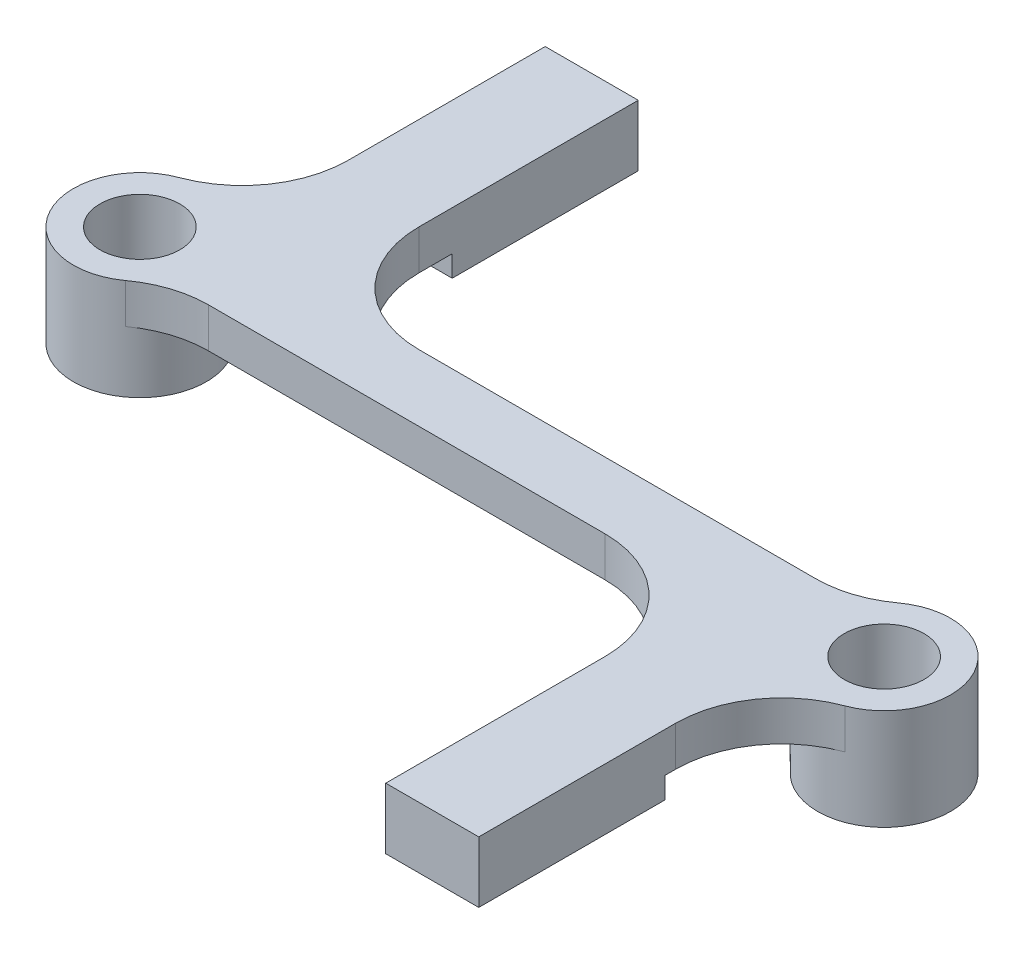
ISO-10303-21;
HEADER;
FILE_DESCRIPTION(('STEP AP214'),'2;1');
FILE_NAME('part.step','',(''),(''),'','','');
FILE_SCHEMA(('AUTOMOTIVE_DESIGN { 1 0 10303 214 1 1 1 1 }'));
ENDSEC;
DATA;
#1=APPLICATION_CONTEXT('core data for automotive mechanical design processes');
#2=APPLICATION_PROTOCOL_DEFINITION('international standard','automotive_design',2000,#1);
#3=PRODUCT_CONTEXT('',#1,'mechanical');
#4=PRODUCT('Part','Part','',(#3));
#5=PRODUCT_RELATED_PRODUCT_CATEGORY('part','',(#4));
#6=PRODUCT_DEFINITION_FORMATION('','',#4);
#7=PRODUCT_DEFINITION_CONTEXT('part definition',#1,'design');
#8=PRODUCT_DEFINITION('design','',#6,#7);
#9=PRODUCT_DEFINITION_SHAPE('','',#8);
#10=(LENGTH_UNIT() NAMED_UNIT(*) SI_UNIT(.MILLI.,.METRE.));
#11=(NAMED_UNIT(*) PLANE_ANGLE_UNIT() SI_UNIT($,.RADIAN.));
#12=(NAMED_UNIT(*) SI_UNIT($,.STERADIAN.) SOLID_ANGLE_UNIT());
#13=UNCERTAINTY_MEASURE_WITH_UNIT(LENGTH_MEASURE(1.E-05),#10,'distance_accuracy_value','');
#14=(GEOMETRIC_REPRESENTATION_CONTEXT(3) GLOBAL_UNCERTAINTY_ASSIGNED_CONTEXT((#13)) GLOBAL_UNIT_ASSIGNED_CONTEXT((#10,
#11,#12)) REPRESENTATION_CONTEXT('',''));
#15=CARTESIAN_POINT('',(0.,0.,0.));
#16=DIRECTION('',(0.,0.,1.));
#17=DIRECTION('',(1.,0.,0.));
#18=AXIS2_PLACEMENT_3D('',#15,#16,#17);
#19=CARTESIAN_POINT('',(-8.75,-12.7401923062409,0.));
#20=DIRECTION('',(1.,0.,0.));
#21=DIRECTION('',(0.,0.,-1.));
#22=AXIS2_PLACEMENT_3D('',#19,#20,#21);
#23=PLANE('',#22);
#24=DIRECTION('',(0.,0.,-1.));
#25=VECTOR('',#24,1.);
#26=CARTESIAN_POINT('',(-8.75,3.8,0.));
#27=LINE('',#26,#25);
#28=CARTESIAN_POINT('',(-8.75,3.8,-5.25));
#29=VERTEX_POINT('',#28);
#30=CARTESIAN_POINT('',(-8.75,3.8,-13.5));
#31=VERTEX_POINT('',#30);
#32=EDGE_CURVE('E202',#29,#31,#27,.T.);
#33=ORIENTED_EDGE('',*,*,#32,.F.);
#34=DIRECTION('',(0.,1.,0.));
#35=VECTOR('',#34,1.);
#36=CARTESIAN_POINT('',(-8.75,2.3,-5.25));
#37=LINE('',#36,#35);
#38=CARTESIAN_POINT('',(-8.75,2.3,-5.25));
#39=VERTEX_POINT('',#38);
#40=EDGE_CURVE('E245',#29,#39,#37,.F.);
#41=ORIENTED_EDGE('',*,*,#40,.T.);
#42=DIRECTION('',(0.,0.,1.));
#43=VECTOR('',#42,1.);
#44=CARTESIAN_POINT('',(-8.75,2.3,0.));
#45=LINE('',#44,#43);
#46=CARTESIAN_POINT('',(-8.75,2.3,-6.5));
#47=VERTEX_POINT('',#46);
#48=EDGE_CURVE('E313',#47,#39,#45,.T.);
#49=ORIENTED_EDGE('',*,*,#48,.F.);
#50=DIRECTION('',(0.,-1.,0.));
#51=VECTOR('',#50,1.);
#52=CARTESIAN_POINT('',(-8.75,31.5353564967173,-6.5));
#53=LINE('',#52,#51);
#54=CARTESIAN_POINT('',(-8.75,1.5,-6.5));
#55=VERTEX_POINT('',#54);
#56=EDGE_CURVE('E192',#47,#55,#53,.T.);
#57=ORIENTED_EDGE('',*,*,#56,.T.);
#58=DIRECTION('',(0.,0.,1.));
#59=VECTOR('',#58,1.);
#60=CARTESIAN_POINT('',(-8.75,1.5,-13.5));
#61=LINE('',#60,#59);
#62=CARTESIAN_POINT('',(-8.75,1.5,-13.5));
#63=VERTEX_POINT('',#62);
#64=EDGE_CURVE('E175',#63,#55,#61,.T.);
#65=ORIENTED_EDGE('',*,*,#64,.F.);
#66=DIRECTION('',(0.,1.,0.));
#67=VECTOR('',#66,1.);
#68=CARTESIAN_POINT('',(-8.75,-12.7401923062409,-13.5));
#69=LINE('',#68,#67);
#70=EDGE_CURVE('E189',#63,#31,#69,.T.);
#71=ORIENTED_EDGE('',*,*,#70,.T.);
#72=EDGE_LOOP('',(#33,#41,#49,#57,#65,#71));
#73=FACE_BOUND('',#72,.T.);
#74=ADVANCED_FACE('F38',(#73),#23,.T.);
#75=CARTESIAN_POINT('',(0.,-12.7401923062409,-13.5));
#76=DIRECTION('',(0.,0.,1.));
#77=DIRECTION('',(1.,0.,0.));
#78=AXIS2_PLACEMENT_3D('',#75,#76,#77);
#79=PLANE('',#78);
#80=DIRECTION('',(1.,0.,0.));
#81=VECTOR('',#80,1.);
#82=CARTESIAN_POINT('',(-12.25,1.5,-13.5));
#83=LINE('',#82,#81);
#84=CARTESIAN_POINT('',(-12.25,1.5,-13.5));
#85=VERTEX_POINT('',#84);
#86=EDGE_CURVE('E172',#85,#63,#83,.T.);
#87=ORIENTED_EDGE('',*,*,#86,.F.);
#88=DIRECTION('',(0.,1.,0.));
#89=VECTOR('',#88,1.);
#90=CARTESIAN_POINT('',(-12.25,-12.7401923062409,-13.5));
#91=LINE('',#90,#89);
#92=CARTESIAN_POINT('',(-12.25,3.8,-13.5));
#93=VERTEX_POINT('',#92);
#94=EDGE_CURVE('E198',#85,#93,#91,.T.);
#95=ORIENTED_EDGE('',*,*,#94,.T.);
#96=DIRECTION('',(1.,0.,0.));
#97=VECTOR('',#96,1.);
#98=CARTESIAN_POINT('',(0.,3.8,-13.5));
#99=LINE('',#98,#97);
#100=EDGE_CURVE('E197',#93,#31,#99,.T.);
#101=ORIENTED_EDGE('',*,*,#100,.T.);
#102=ORIENTED_EDGE('',*,*,#70,.F.);
#103=EDGE_LOOP('',(#87,#95,#101,#102));
#104=FACE_BOUND('',#103,.T.);
#105=ADVANCED_FACE('F195',(#104),#79,.F.);
#106=CARTESIAN_POINT('',(-12.25,-12.7401923062409,0.));
#107=DIRECTION('',(1.,0.,0.));
#108=DIRECTION('',(0.,0.,-1.));
#109=AXIS2_PLACEMENT_3D('',#106,#107,#108);
#110=PLANE('',#109);
#111=DIRECTION('',(0.,0.,-1.));
#112=VECTOR('',#111,1.);
#113=CARTESIAN_POINT('',(-12.25,2.3,0.));
#114=LINE('',#113,#112);
#115=CARTESIAN_POINT('',(-12.25,2.3,-6.09815545882523));
#116=VERTEX_POINT('',#115);
#117=CARTESIAN_POINT('',(-12.25,2.3,-6.5));
#118=VERTEX_POINT('',#117);
#119=EDGE_CURVE('E320',#116,#118,#114,.T.);
#120=ORIENTED_EDGE('',*,*,#119,.F.);
#121=DIRECTION('',(0.,1.,0.));
#122=VECTOR('',#121,1.);
#123=CARTESIAN_POINT('',(-12.25,3.8,-6.09815545882523));
#124=LINE('',#123,#122);
#125=CARTESIAN_POINT('',(-12.25,3.8,-6.09815545882523));
#126=VERTEX_POINT('',#125);
#127=EDGE_CURVE('E247',#116,#126,#124,.T.);
#128=ORIENTED_EDGE('',*,*,#127,.T.);
#129=DIRECTION('',(0.,0.,-1.));
#130=VECTOR('',#129,1.);
#131=CARTESIAN_POINT('',(-12.25,3.8,0.));
#132=LINE('',#131,#130);
#133=EDGE_CURVE('E344',#126,#93,#132,.T.);
#134=ORIENTED_EDGE('',*,*,#133,.T.);
#135=ORIENTED_EDGE('',*,*,#94,.F.);
#136=DIRECTION('',(0.,0.,-1.));
#137=VECTOR('',#136,1.);
#138=CARTESIAN_POINT('',(-12.25,1.5,-6.5));
#139=LINE('',#138,#137);
#140=CARTESIAN_POINT('',(-12.25,1.5,-6.5));
#141=VERTEX_POINT('',#140);
#142=EDGE_CURVE('E178',#141,#85,#139,.T.);
#143=ORIENTED_EDGE('',*,*,#142,.F.);
#144=DIRECTION('',(0.,-1.,0.));
#145=VECTOR('',#144,1.);
#146=CARTESIAN_POINT('',(-12.25,31.5353564967173,-6.5));
#147=LINE('',#146,#145);
#148=EDGE_CURVE('E327',#118,#141,#147,.T.);
#149=ORIENTED_EDGE('',*,*,#148,.F.);
#150=EDGE_LOOP('',(#120,#128,#134,#135,#143,#149));
#151=FACE_BOUND('',#150,.T.);
#152=ADVANCED_FACE('F378',(#151),#110,.F.);
#153=CARTESIAN_POINT('',(12.25,-12.7401923062409,1.25));
#154=DIRECTION('',(-1.,0.,0.));
#155=DIRECTION('',(0.,0.,1.));
#156=AXIS2_PLACEMENT_3D('',#153,#154,#155);
#157=PLANE('',#156);
#158=DIRECTION('',(0.,0.,1.));
#159=VECTOR('',#158,1.);
#160=CARTESIAN_POINT('',(12.25,2.3,0.));
#161=LINE('',#160,#159);
#162=CARTESIAN_POINT('',(12.25,2.3,6.09815545882523));
#163=VERTEX_POINT('',#162);
#164=CARTESIAN_POINT('',(12.25,2.3,6.5));
#165=VERTEX_POINT('',#164);
#166=EDGE_CURVE('E302',#163,#165,#161,.T.);
#167=ORIENTED_EDGE('',*,*,#166,.F.);
#168=DIRECTION('',(0.,1.,0.));
#169=VECTOR('',#168,1.);
#170=CARTESIAN_POINT('',(12.25,3.8,6.09815545882523));
#171=LINE('',#170,#169);
#172=CARTESIAN_POINT('',(12.25,3.8,6.09815545882523));
#173=VERTEX_POINT('',#172);
#174=EDGE_CURVE('E263',#163,#173,#171,.T.);
#175=ORIENTED_EDGE('',*,*,#174,.T.);
#176=DIRECTION('',(0.,0.,1.));
#177=VECTOR('',#176,1.);
#178=CARTESIAN_POINT('',(12.25,3.8,6.5));
#179=LINE('',#178,#177);
#180=CARTESIAN_POINT('',(12.25,3.8,13.5));
#181=VERTEX_POINT('',#180);
#182=EDGE_CURVE('E293',#173,#181,#179,.T.);
#183=ORIENTED_EDGE('',*,*,#182,.T.);
#184=DIRECTION('',(0.,1.,0.));
#185=VECTOR('',#184,1.);
#186=CARTESIAN_POINT('',(12.25,-12.7401923062409,13.5));
#187=LINE('',#186,#185);
#188=CARTESIAN_POINT('',(12.25,1.5,13.5));
#189=VERTEX_POINT('',#188);
#190=EDGE_CURVE('E334',#189,#181,#187,.T.);
#191=ORIENTED_EDGE('',*,*,#190,.F.);
#192=DIRECTION('',(0.,0.,1.));
#193=VECTOR('',#192,1.);
#194=CARTESIAN_POINT('',(12.25,1.5,6.5));
#195=LINE('',#194,#193);
#196=CARTESIAN_POINT('',(12.25,1.5,6.5));
#197=VERTEX_POINT('',#196);
#198=EDGE_CURVE('E673',#197,#189,#195,.T.);
#199=ORIENTED_EDGE('',*,*,#198,.F.);
#200=DIRECTION('',(0.,-1.,0.));
#201=VECTOR('',#200,1.);
#202=CARTESIAN_POINT('',(12.25,31.5353564967173,6.5));
#203=LINE('',#202,#201);
#204=EDGE_CURVE('E305',#165,#197,#203,.T.);
#205=ORIENTED_EDGE('',*,*,#204,.F.);
#206=EDGE_LOOP('',(#167,#175,#183,#191,#199,#205));
#207=FACE_BOUND('',#206,.T.);
#208=ADVANCED_FACE('F298',(#207),#157,.F.);
#209=CARTESIAN_POINT('',(8.75,-12.7401923062409,1.25));
#210=DIRECTION('',(-1.,0.,0.));
#211=DIRECTION('',(0.,0.,1.));
#212=AXIS2_PLACEMENT_3D('',#209,#210,#211);
#213=PLANE('',#212);
#214=DIRECTION('',(0.,0.,1.));
#215=VECTOR('',#214,1.);
#216=CARTESIAN_POINT('',(8.75,3.8,6.5));
#217=LINE('',#216,#215);
#218=CARTESIAN_POINT('',(8.75,3.8,5.25));
#219=VERTEX_POINT('',#218);
#220=CARTESIAN_POINT('',(8.75,3.8,13.5));
#221=VERTEX_POINT('',#220);
#222=EDGE_CURVE('E336',#219,#221,#217,.T.);
#223=ORIENTED_EDGE('',*,*,#222,.F.);
#224=DIRECTION('',(0.,1.,0.));
#225=VECTOR('',#224,1.);
#226=CARTESIAN_POINT('',(8.75,-12.7401923062409,5.25));
#227=LINE('',#226,#225);
#228=CARTESIAN_POINT('',(8.75,2.3,5.25));
#229=VERTEX_POINT('',#228);
#230=EDGE_CURVE('E261',#219,#229,#227,.F.);
#231=ORIENTED_EDGE('',*,*,#230,.T.);
#232=DIRECTION('',(0.,0.,-1.));
#233=VECTOR('',#232,1.);
#234=CARTESIAN_POINT('',(8.75,2.3,0.));
#235=LINE('',#234,#233);
#236=CARTESIAN_POINT('',(8.75,2.3,6.5));
#237=VERTEX_POINT('',#236);
#238=EDGE_CURVE('E329',#237,#229,#235,.T.);
#239=ORIENTED_EDGE('',*,*,#238,.F.);
#240=DIRECTION('',(0.,-1.,0.));
#241=VECTOR('',#240,1.);
#242=CARTESIAN_POINT('',(8.75,31.5353564967173,6.5));
#243=LINE('',#242,#241);
#244=CARTESIAN_POINT('',(8.75,1.5,6.5));
#245=VERTEX_POINT('',#244);
#246=EDGE_CURVE('E310',#237,#245,#243,.T.);
#247=ORIENTED_EDGE('',*,*,#246,.T.);
#248=DIRECTION('',(0.,0.,-1.));
#249=VECTOR('',#248,1.);
#250=CARTESIAN_POINT('',(8.75,1.5,13.5));
#251=LINE('',#250,#249);
#252=CARTESIAN_POINT('',(8.75,1.5,13.5));
#253=VERTEX_POINT('',#252);
#254=EDGE_CURVE('E668',#253,#245,#251,.T.);
#255=ORIENTED_EDGE('',*,*,#254,.F.);
#256=DIRECTION('',(0.,1.,0.));
#257=VECTOR('',#256,1.);
#258=CARTESIAN_POINT('',(8.75,-12.7401923062409,13.5));
#259=LINE('',#258,#257);
#260=EDGE_CURVE('E337',#253,#221,#259,.T.);
#261=ORIENTED_EDGE('',*,*,#260,.T.);
#262=EDGE_LOOP('',(#223,#231,#239,#247,#255,#261));
#263=FACE_BOUND('',#262,.T.);
#264=ADVANCED_FACE('F503',(#263),#213,.T.);
#265=CARTESIAN_POINT('',(8.75,-12.7401923062409,13.5));
#266=DIRECTION('',(0.,0.,1.));
#267=DIRECTION('',(1.,0.,0.));
#268=AXIS2_PLACEMENT_3D('',#265,#266,#267);
#269=PLANE('',#268);
#270=ORIENTED_EDGE('',*,*,#260,.F.);
#271=DIRECTION('',(-1.,0.,0.));
#272=VECTOR('',#271,1.);
#273=CARTESIAN_POINT('',(12.25,1.5,13.5));
#274=LINE('',#273,#272);
#275=EDGE_CURVE('E183',#189,#253,#274,.T.);
#276=ORIENTED_EDGE('',*,*,#275,.F.);
#277=ORIENTED_EDGE('',*,*,#190,.T.);
#278=DIRECTION('',(1.,0.,0.));
#279=VECTOR('',#278,1.);
#280=CARTESIAN_POINT('',(8.75,3.8,13.5));
#281=LINE('',#280,#279);
#282=EDGE_CURVE('E342',#221,#181,#281,.T.);
#283=ORIENTED_EDGE('',*,*,#282,.F.);
#284=EDGE_LOOP('',(#270,#276,#277,#283));
#285=FACE_BOUND('',#284,.T.);
#286=ADVANCED_FACE('F507',(#285),#269,.T.);
#287=CARTESIAN_POINT('',(0.,31.5353564967173,-6.5));
#288=DIRECTION('',(0.,0.,-1.));
#289=DIRECTION('',(-1.,0.,0.));
#290=AXIS2_PLACEMENT_3D('',#287,#288,#289);
#291=PLANE('',#290);
#292=DIRECTION('',(-1.,0.,0.));
#293=VECTOR('',#292,1.);
#294=CARTESIAN_POINT('',(-8.75,1.5,-6.5));
#295=LINE('',#294,#293);
#296=EDGE_CURVE('E193',#55,#141,#295,.T.);
#297=ORIENTED_EDGE('',*,*,#296,.F.);
#298=ORIENTED_EDGE('',*,*,#56,.F.);
#299=DIRECTION('',(1.,0.,0.));
#300=VECTOR('',#299,1.);
#301=CARTESIAN_POINT('',(0.,2.3,-6.5));
#302=LINE('',#301,#300);
#303=EDGE_CURVE('E324',#118,#47,#302,.T.);
#304=ORIENTED_EDGE('',*,*,#303,.F.);
#305=ORIENTED_EDGE('',*,*,#148,.T.);
#306=EDGE_LOOP('',(#297,#298,#304,#305));
#307=FACE_BOUND('',#306,.T.);
#308=ADVANCED_FACE('F623',(#307),#291,.F.);
#309=CARTESIAN_POINT('',(0.,31.5353564967173,6.5));
#310=DIRECTION('',(0.,0.,-1.));
#311=DIRECTION('',(-1.,0.,0.));
#312=AXIS2_PLACEMENT_3D('',#309,#310,#311);
#313=PLANE('',#312);
#314=ORIENTED_EDGE('',*,*,#204,.T.);
#315=DIRECTION('',(1.,0.,0.));
#316=VECTOR('',#315,1.);
#317=CARTESIAN_POINT('',(8.75,1.5,6.5));
#318=LINE('',#317,#316);
#319=EDGE_CURVE('E670',#245,#197,#318,.T.);
#320=ORIENTED_EDGE('',*,*,#319,.F.);
#321=ORIENTED_EDGE('',*,*,#246,.F.);
#322=DIRECTION('',(1.,0.,0.));
#323=VECTOR('',#322,1.);
#324=CARTESIAN_POINT('',(0.,2.3,6.5));
#325=LINE('',#324,#323);
#326=EDGE_CURVE('E317',#237,#165,#325,.T.);
#327=ORIENTED_EDGE('',*,*,#326,.T.);
#328=EDGE_LOOP('',(#314,#320,#321,#327));
#329=FACE_BOUND('',#328,.T.);
#330=ADVANCED_FACE('F391',(#329),#313,.T.);
#331=CARTESIAN_POINT('',(0.,0.,0.));
#332=DIRECTION('',(0.,1.,0.));
#333=DIRECTION('',(0.,0.,1.));
#334=AXIS2_PLACEMENT_3D('',#331,#332,#333);
#335=PLANE('',#334);
#336=CARTESIAN_POINT('',(14.,0.,0.));
#337=DIRECTION('',(0.,1.,0.));
#338=DIRECTION('',(0.,0.,1.));
#339=AXIS2_PLACEMENT_3D('',#336,#337,#338);
#340=CIRCLE('',#339,1.5);
#341=CARTESIAN_POINT('',(14.,0.,-1.5));
#342=VERTEX_POINT('',#341);
#343=EDGE_CURVE('E209',#342,#342,#340,.T.);
#344=ORIENTED_EDGE('',*,*,#343,.T.);
#345=EDGE_LOOP('',(#344));
#346=FACE_BOUND('',#345,.T.);
#347=CARTESIAN_POINT('',(14.,0.,0.));
#348=DIRECTION('',(0.,1.,0.));
#349=DIRECTION('',(0.,0.,1.));
#350=AXIS2_PLACEMENT_3D('',#347,#348,#349);
#351=CIRCLE('',#350,2.5);
#352=CARTESIAN_POINT('',(14.,0.,2.5));
#353=VERTEX_POINT('',#352);
#354=EDGE_CURVE('E230',#353,#353,#351,.T.);
#355=ORIENTED_EDGE('',*,*,#354,.F.);
#356=EDGE_LOOP('',(#355));
#357=FACE_BOUND('',#356,.T.);
#358=ADVANCED_FACE('F387',(#346,#357),#335,.F.);
#359=CARTESIAN_POINT('',(-14.,0.,0.));
#360=DIRECTION('',(0.,1.,0.));
#361=DIRECTION('',(0.,0.,1.));
#362=AXIS2_PLACEMENT_3D('',#359,#360,#361);
#363=CIRCLE('',#362,1.5);
#364=CARTESIAN_POINT('',(-14.,0.,-1.5));
#365=VERTEX_POINT('',#364);
#366=EDGE_CURVE('E200',#365,#365,#363,.T.);
#367=ORIENTED_EDGE('',*,*,#366,.T.);
#368=EDGE_LOOP('',(#367));
#369=FACE_BOUND('',#368,.T.);
#370=CARTESIAN_POINT('',(-14.,0.,0.));
#371=DIRECTION('',(0.,1.,0.));
#372=DIRECTION('',(0.,0.,1.));
#373=AXIS2_PLACEMENT_3D('',#370,#371,#372);
#374=CIRCLE('',#373,2.5);
#375=CARTESIAN_POINT('',(-14.,0.,2.5));
#376=VERTEX_POINT('',#375);
#377=EDGE_CURVE('E227',#376,#376,#374,.T.);
#378=ORIENTED_EDGE('',*,*,#377,.F.);
#379=EDGE_LOOP('',(#378));
#380=FACE_BOUND('',#379,.T.);
#381=ADVANCED_FACE('F390',(#369,#380),#335,.F.);
#382=CARTESIAN_POINT('',(14.,3.8,0.));
#383=DIRECTION('',(0.,-1.,0.));
#384=DIRECTION('',(0.,0.,-1.));
#385=AXIS2_PLACEMENT_3D('',#382,#383,#384);
#386=CYLINDRICAL_SURFACE('',#385,2.5);
#387=ORIENTED_EDGE('',*,*,#354,.T.);
#388=EDGE_LOOP('',(#387));
#389=FACE_BOUND('',#388,.T.);
#390=CARTESIAN_POINT('',(14.,2.3,0.));
#391=DIRECTION('',(0.,1.,0.));
#392=DIRECTION('',(0.,0.,1.));
#393=AXIS2_PLACEMENT_3D('',#390,#391,#392);
#394=CIRCLE('',#393,2.5);
#395=CARTESIAN_POINT('',(14.8653846153846,2.3,2.34544440724048));
#396=VERTEX_POINT('',#395);
#397=CARTESIAN_POINT('',(12.5259894503119,2.3,-2.01923076923077));
#398=VERTEX_POINT('',#397);
#399=EDGE_CURVE('E319',#396,#398,#394,.F.);
#400=ORIENTED_EDGE('',*,*,#399,.T.);
#401=DIRECTION('',(0.,-1.,0.));
#402=VECTOR('',#401,1.);
#403=CARTESIAN_POINT('',(12.5259894503119,3.8,-2.01923076923077));
#404=LINE('',#403,#402);
#405=CARTESIAN_POINT('',(12.5259894503119,3.8,-2.01923076923077));
#406=VERTEX_POINT('',#405);
#407=EDGE_CURVE('E243',#398,#406,#404,.F.);
#408=ORIENTED_EDGE('',*,*,#407,.T.);
#409=CARTESIAN_POINT('',(14.,3.8,0.));
#410=DIRECTION('',(0.,1.,0.));
#411=DIRECTION('',(0.,0.,1.));
#412=AXIS2_PLACEMENT_3D('',#409,#410,#411);
#413=CIRCLE('',#412,2.5);
#414=CARTESIAN_POINT('',(14.8653846153846,3.8,2.34544440724047));
#415=VERTEX_POINT('',#414);
#416=EDGE_CURVE('E215',#415,#406,#413,.T.);
#417=ORIENTED_EDGE('',*,*,#416,.F.);
#418=DIRECTION('',(0.,-1.,0.));
#419=VECTOR('',#418,1.);
#420=CARTESIAN_POINT('',(14.8653846153846,3.8,2.34544440724047));
#421=LINE('',#420,#419);
#422=EDGE_CURVE('E240',#415,#396,#421,.T.);
#423=ORIENTED_EDGE('',*,*,#422,.T.);
#424=EDGE_LOOP('',(#400,#408,#417,#423));
#425=FACE_BOUND('',#424,.T.);
#426=ADVANCED_FACE('F295',(#389,#425),#386,.T.);
#427=CARTESIAN_POINT('',(-14.,3.8,0.));
#428=DIRECTION('',(0.,-1.,0.));
#429=DIRECTION('',(0.,0.,-1.));
#430=AXIS2_PLACEMENT_3D('',#427,#428,#429);
#431=CYLINDRICAL_SURFACE('',#430,2.5);
#432=ORIENTED_EDGE('',*,*,#377,.T.);
#433=EDGE_LOOP('',(#432));
#434=FACE_BOUND('',#433,.T.);
#435=CARTESIAN_POINT('',(-14.,3.8,0.));
#436=DIRECTION('',(0.,1.,0.));
#437=DIRECTION('',(0.,0.,1.));
#438=AXIS2_PLACEMENT_3D('',#435,#436,#437);
#439=CIRCLE('',#438,2.5);
#440=CARTESIAN_POINT('',(-14.8653846153846,3.8,-2.34544440724047));
#441=VERTEX_POINT('',#440);
#442=CARTESIAN_POINT('',(-12.5259894503119,3.8,2.01923076923077));
#443=VERTEX_POINT('',#442);
#444=EDGE_CURVE('E208',#441,#443,#439,.T.);
#445=ORIENTED_EDGE('',*,*,#444,.F.);
#446=DIRECTION('',(0.,-1.,0.));
#447=VECTOR('',#446,1.);
#448=CARTESIAN_POINT('',(-14.8653846153846,3.8,-2.34544440724047));
#449=LINE('',#448,#447);
#450=CARTESIAN_POINT('',(-14.8653846153846,2.3,-2.34544440724047));
#451=VERTEX_POINT('',#450);
#452=EDGE_CURVE('E252',#441,#451,#449,.T.);
#453=ORIENTED_EDGE('',*,*,#452,.T.);
#454=CARTESIAN_POINT('',(-14.,2.3,0.));
#455=DIRECTION('',(0.,1.,0.));
#456=DIRECTION('',(0.,0.,1.));
#457=AXIS2_PLACEMENT_3D('',#454,#455,#456);
#458=CIRCLE('',#457,2.5);
#459=CARTESIAN_POINT('',(-12.5259894503119,2.3,2.01923076923077));
#460=VERTEX_POINT('',#459);
#461=EDGE_CURVE('E431',#451,#460,#458,.F.);
#462=ORIENTED_EDGE('',*,*,#461,.T.);
#463=DIRECTION('',(0.,-1.,0.));
#464=VECTOR('',#463,1.);
#465=CARTESIAN_POINT('',(-12.5259894503119,3.8,2.01923076923077));
#466=LINE('',#465,#464);
#467=EDGE_CURVE('E250',#460,#443,#466,.F.);
#468=ORIENTED_EDGE('',*,*,#467,.T.);
#469=EDGE_LOOP('',(#445,#453,#462,#468));
#470=FACE_BOUND('',#469,.T.);
#471=ADVANCED_FACE('F402',(#434,#470),#431,.T.);
#472=CARTESIAN_POINT('',(0.,3.8,1.25));
#473=DIRECTION('',(0.,0.,-1.));
#474=DIRECTION('',(-1.,0.,0.));
#475=AXIS2_PLACEMENT_3D('',#472,#473,#474);
#476=PLANE('',#475);
#477=DIRECTION('',(1.,0.,0.));
#478=VECTOR('',#477,1.);
#479=CARTESIAN_POINT('',(0.,3.8,1.25));
#480=LINE('',#479,#478);
#481=CARTESIAN_POINT('',(-10.167572570811,3.8,1.25));
#482=VERTEX_POINT('',#481);
#483=CARTESIAN_POINT('',(4.75,3.8,1.25));
#484=VERTEX_POINT('',#483);
#485=EDGE_CURVE('E212',#482,#484,#480,.T.);
#486=ORIENTED_EDGE('',*,*,#485,.F.);
#487=DIRECTION('',(0.,1.,0.));
#488=VECTOR('',#487,1.);
#489=CARTESIAN_POINT('',(-10.167572570811,2.3,1.25));
#490=LINE('',#489,#488);
#491=CARTESIAN_POINT('',(-10.167572570811,2.3,1.25));
#492=VERTEX_POINT('',#491);
#493=EDGE_CURVE('E258',#482,#492,#490,.F.);
#494=ORIENTED_EDGE('',*,*,#493,.T.);
#495=DIRECTION('',(1.,0.,0.));
#496=VECTOR('',#495,1.);
#497=CARTESIAN_POINT('',(0.,2.3,1.25));
#498=LINE('',#497,#496);
#499=CARTESIAN_POINT('',(4.75,2.3,1.25));
#500=VERTEX_POINT('',#499);
#501=EDGE_CURVE('E438',#492,#500,#498,.T.);
#502=ORIENTED_EDGE('',*,*,#501,.T.);
#503=DIRECTION('',(0.,1.,0.));
#504=VECTOR('',#503,1.);
#505=CARTESIAN_POINT('',(4.75,3.8,1.25));
#506=LINE('',#505,#504);
#507=EDGE_CURVE('E255',#500,#484,#506,.T.);
#508=ORIENTED_EDGE('',*,*,#507,.T.);
#509=EDGE_LOOP('',(#486,#494,#502,#508));
#510=FACE_BOUND('',#509,.T.);
#511=ADVANCED_FACE('F399',(#510),#476,.F.);
#512=CARTESIAN_POINT('',(0.,3.8,-1.25));
#513=DIRECTION('',(0.,0.,-1.));
#514=DIRECTION('',(-1.,0.,0.));
#515=AXIS2_PLACEMENT_3D('',#512,#513,#514);
#516=PLANE('',#515);
#517=DIRECTION('',(1.,0.,0.));
#518=VECTOR('',#517,1.);
#519=CARTESIAN_POINT('',(0.,3.8,-1.25));
#520=LINE('',#519,#518);
#521=CARTESIAN_POINT('',(-4.75,3.8,-1.25));
#522=VERTEX_POINT('',#521);
#523=CARTESIAN_POINT('',(10.167572570811,3.8,-1.25));
#524=VERTEX_POINT('',#523);
#525=EDGE_CURVE('E218',#522,#524,#520,.T.);
#526=ORIENTED_EDGE('',*,*,#525,.T.);
#527=DIRECTION('',(0.,-1.,0.));
#528=VECTOR('',#527,1.);
#529=CARTESIAN_POINT('',(10.167572570811,3.8,-1.25));
#530=LINE('',#529,#528);
#531=CARTESIAN_POINT('',(10.167572570811,2.3,-1.25));
#532=VERTEX_POINT('',#531);
#533=EDGE_CURVE('E237',#524,#532,#530,.T.);
#534=ORIENTED_EDGE('',*,*,#533,.T.);
#535=DIRECTION('',(1.,0.,0.));
#536=VECTOR('',#535,1.);
#537=CARTESIAN_POINT('',(0.,2.3,-1.25));
#538=LINE('',#537,#536);
#539=CARTESIAN_POINT('',(-4.75,2.3,-1.25));
#540=VERTEX_POINT('',#539);
#541=EDGE_CURVE('E308',#540,#532,#538,.T.);
#542=ORIENTED_EDGE('',*,*,#541,.F.);
#543=DIRECTION('',(0.,1.,0.));
#544=VECTOR('',#543,1.);
#545=CARTESIAN_POINT('',(-4.75,3.8,-1.25));
#546=LINE('',#545,#544);
#547=EDGE_CURVE('E224',#540,#522,#546,.T.);
#548=ORIENTED_EDGE('',*,*,#547,.T.);
#549=EDGE_LOOP('',(#526,#534,#542,#548));
#550=FACE_BOUND('',#549,.T.);
#551=ADVANCED_FACE('F356',(#550),#516,.T.);
#552=CARTESIAN_POINT('',(-14.,3.8,0.));
#553=DIRECTION('',(0.,-1.,0.));
#554=DIRECTION('',(0.,0.,-1.));
#555=AXIS2_PLACEMENT_3D('',#552,#553,#554);
#556=CYLINDRICAL_SURFACE('',#555,1.5);
#557=CARTESIAN_POINT('',(-14.,3.8,0.));
#558=DIRECTION('',(0.,1.,0.));
#559=DIRECTION('',(0.,0.,1.));
#560=AXIS2_PLACEMENT_3D('',#557,#558,#559);
#561=CIRCLE('',#560,1.5);
#562=CARTESIAN_POINT('',(-14.,3.8,-1.5));
#563=VERTEX_POINT('',#562);
#564=EDGE_CURVE('E205',#563,#563,#561,.T.);
#565=CARTESIAN_POINT('',(-14.,3.8,-1.5));
#566=CARTESIAN_POINT('',(-14.,3.76041666666667,-1.5));
#567=CARTESIAN_POINT('',(-14.,3.72083333333333,-1.5));
#568=CARTESIAN_POINT('',(-14.,3.64166666666667,-1.5));
#569=CARTESIAN_POINT('',(-14.,3.60208333333333,-1.5));
#570=CARTESIAN_POINT('',(-14.,3.52291666666667,-1.5));
#571=CARTESIAN_POINT('',(-14.,3.48333333333333,-1.5));
#572=CARTESIAN_POINT('',(-14.,3.40416666666667,-1.5));
#573=CARTESIAN_POINT('',(-14.,3.36458333333333,-1.5));
#574=CARTESIAN_POINT('',(-14.,3.28541666666667,-1.5));
#575=CARTESIAN_POINT('',(-14.,3.24583333333333,-1.5));
#576=CARTESIAN_POINT('',(-14.,3.16666666666667,-1.5));
#577=CARTESIAN_POINT('',(-14.,3.12708333333333,-1.5));
#578=CARTESIAN_POINT('',(-14.,3.04791666666667,-1.5));
#579=CARTESIAN_POINT('',(-14.,3.00833333333333,-1.5));
#580=CARTESIAN_POINT('',(-14.,2.92916666666667,-1.5));
#581=CARTESIAN_POINT('',(-14.,2.88958333333333,-1.5));
#582=CARTESIAN_POINT('',(-14.,2.81041666666667,-1.5));
#583=CARTESIAN_POINT('',(-14.,2.77083333333333,-1.5));
#584=CARTESIAN_POINT('',(-14.,2.69166666666667,-1.5));
#585=CARTESIAN_POINT('',(-14.,2.65208333333333,-1.5));
#586=CARTESIAN_POINT('',(-14.,2.57291666666667,-1.5));
#587=CARTESIAN_POINT('',(-14.,2.53333333333333,-1.5));
#588=CARTESIAN_POINT('',(-14.,2.45416666666667,-1.5));
#589=CARTESIAN_POINT('',(-14.,2.41458333333333,-1.5));
#590=CARTESIAN_POINT('',(-14.,2.33541666666667,-1.5));
#591=CARTESIAN_POINT('',(-14.,2.29583333333333,-1.5));
#592=CARTESIAN_POINT('',(-14.,2.21666666666667,-1.5));
#593=CARTESIAN_POINT('',(-14.,2.17708333333333,-1.5));
#594=CARTESIAN_POINT('',(-14.,2.09791666666667,-1.5));
#595=CARTESIAN_POINT('',(-14.,2.05833333333333,-1.5));
#596=CARTESIAN_POINT('',(-14.,1.97916666666667,-1.5));
#597=CARTESIAN_POINT('',(-14.,1.93958333333333,-1.5));
#598=CARTESIAN_POINT('',(-14.,1.86041666666667,-1.5));
#599=CARTESIAN_POINT('',(-14.,1.82083333333333,-1.5));
#600=CARTESIAN_POINT('',(-14.,1.74166666666667,-1.5));
#601=CARTESIAN_POINT('',(-14.,1.70208333333333,-1.5));
#602=CARTESIAN_POINT('',(-14.,1.62291666666667,-1.5));
#603=CARTESIAN_POINT('',(-14.,1.58333333333333,-1.5));
#604=CARTESIAN_POINT('',(-14.,1.50416666666667,-1.5));
#605=CARTESIAN_POINT('',(-14.,1.46458333333333,-1.5));
#606=CARTESIAN_POINT('',(-14.,1.38541666666667,-1.5));
#607=CARTESIAN_POINT('',(-14.,1.34583333333333,-1.5));
#608=CARTESIAN_POINT('',(-14.,1.26666666666667,-1.5));
#609=CARTESIAN_POINT('',(-14.,1.22708333333333,-1.5));
#610=CARTESIAN_POINT('',(-14.,1.14791666666667,-1.5));
#611=CARTESIAN_POINT('',(-14.,1.10833333333333,-1.5));
#612=CARTESIAN_POINT('',(-14.,1.02916666666667,-1.5));
#613=CARTESIAN_POINT('',(-14.,0.989583333333333,-1.5));
#614=CARTESIAN_POINT('',(-14.,0.910416666666667,-1.5));
#615=CARTESIAN_POINT('',(-14.,0.870833333333333,-1.5));
#616=CARTESIAN_POINT('',(-14.,0.791666666666667,-1.5));
#617=CARTESIAN_POINT('',(-14.,0.752083333333333,-1.5));
#618=CARTESIAN_POINT('',(-14.,0.672916666666667,-1.5));
#619=CARTESIAN_POINT('',(-14.,0.633333333333333,-1.5));
#620=CARTESIAN_POINT('',(-14.,0.554166666666667,-1.5));
#621=CARTESIAN_POINT('',(-14.,0.514583333333334,-1.5));
#622=CARTESIAN_POINT('',(-14.,0.435416666666667,-1.5));
#623=CARTESIAN_POINT('',(-14.,0.395833333333333,-1.5));
#624=CARTESIAN_POINT('',(-14.,0.316666666666666,-1.5));
#625=CARTESIAN_POINT('',(-14.,0.277083333333333,-1.5));
#626=CARTESIAN_POINT('',(-14.,0.197916666666667,-1.5));
#627=CARTESIAN_POINT('',(-14.,0.158333333333333,-1.5));
#628=CARTESIAN_POINT('',(-14.,0.0791666666666666,-1.5));
#629=CARTESIAN_POINT('',(-14.,0.0395833333333333,-1.5));
#630=CARTESIAN_POINT('',(-14.,0.,-1.5));
#631=B_SPLINE_CURVE_WITH_KNOTS('',3,(#565,#566,#567,#568,#569,#570,#571,#572,#573,#574,#575,
#576,#577,#578,#579,#580,#581,#582,#583,#584,#585,#586,#587,#588,#589,#590,#591,#592,#593,#594,
#595,#596,#597,#598,#599,#600,#601,#602,#603,#604,#605,#606,#607,#608,#609,#610,#611,#612,#613,
#614,#615,#616,#617,#618,#619,#620,#621,#622,#623,#624,#625,#626,#627,#628,#629,#630),
.UNSPECIFIED.,.F.,.F.,(4,2,2,2,2,2,2,2,2,2,2,2,2,2,2,2,2,2,2,2,2,2,2,2,2,2,2,2,2,2,2,2,4),(0.,
0.11875,0.2375,0.35625,0.475,0.59375,0.7125,0.831249999999999,0.95,1.06875,1.1875,1.30625,1.425,
1.54375,1.6625,1.78125,1.9,2.01875,2.1375,2.25625,2.375,2.49375,2.6125,2.73125,2.85,2.96875,
3.0875,3.20625,3.325,3.44375,3.5625,3.68125,3.8),.UNSPECIFIED.);
#632=EDGE_CURVE('BSEAM395',#563,#365,#631,.T.);
#633=ORIENTED_EDGE('',*,*,#564,.T.);
#634=ORIENTED_EDGE('',*,*,#366,.F.);
#635=ORIENTED_EDGE('',*,*,#632,.T.);
#636=ORIENTED_EDGE('',*,*,#632,.F.);
#637=EDGE_LOOP('',(#633,#635,#634,#636));
#638=FACE_BOUND('',#637,.T.);
#639=ADVANCED_FACE('F395',(#638),#556,.F.);
#640=CARTESIAN_POINT('',(14.,3.8,0.));
#641=DIRECTION('',(0.,-1.,0.));
#642=DIRECTION('',(0.,0.,-1.));
#643=AXIS2_PLACEMENT_3D('',#640,#641,#642);
#644=CYLINDRICAL_SURFACE('',#643,1.5);
#645=CARTESIAN_POINT('',(14.,3.8,0.));
#646=DIRECTION('',(0.,1.,0.));
#647=DIRECTION('',(0.,0.,1.));
#648=AXIS2_PLACEMENT_3D('',#645,#646,#647);
#649=CIRCLE('',#648,1.5);
#650=CARTESIAN_POINT('',(14.,3.8,-1.5));
#651=VERTEX_POINT('',#650);
#652=EDGE_CURVE('E221',#651,#651,#649,.T.);
#653=CARTESIAN_POINT('',(14.,3.8,-1.5));
#654=CARTESIAN_POINT('',(14.,3.76041666666667,-1.5));
#655=CARTESIAN_POINT('',(14.,3.72083333333333,-1.5));
#656=CARTESIAN_POINT('',(14.,3.64166666666667,-1.5));
#657=CARTESIAN_POINT('',(14.,3.60208333333333,-1.5));
#658=CARTESIAN_POINT('',(14.,3.52291666666667,-1.5));
#659=CARTESIAN_POINT('',(14.,3.48333333333333,-1.5));
#660=CARTESIAN_POINT('',(14.,3.40416666666667,-1.5));
#661=CARTESIAN_POINT('',(14.,3.36458333333333,-1.5));
#662=CARTESIAN_POINT('',(14.,3.28541666666667,-1.5));
#663=CARTESIAN_POINT('',(14.,3.24583333333333,-1.5));
#664=CARTESIAN_POINT('',(14.,3.16666666666667,-1.5));
#665=CARTESIAN_POINT('',(14.,3.12708333333333,-1.5));
#666=CARTESIAN_POINT('',(14.,3.04791666666667,-1.5));
#667=CARTESIAN_POINT('',(14.,3.00833333333333,-1.5));
#668=CARTESIAN_POINT('',(14.,2.92916666666667,-1.5));
#669=CARTESIAN_POINT('',(14.,2.88958333333333,-1.5));
#670=CARTESIAN_POINT('',(14.,2.81041666666667,-1.5));
#671=CARTESIAN_POINT('',(14.,2.77083333333333,-1.5));
#672=CARTESIAN_POINT('',(14.,2.69166666666667,-1.5));
#673=CARTESIAN_POINT('',(14.,2.65208333333333,-1.5));
#674=CARTESIAN_POINT('',(14.,2.57291666666667,-1.5));
#675=CARTESIAN_POINT('',(14.,2.53333333333333,-1.5));
#676=CARTESIAN_POINT('',(14.,2.45416666666667,-1.5));
#677=CARTESIAN_POINT('',(14.,2.41458333333333,-1.5));
#678=CARTESIAN_POINT('',(14.,2.33541666666667,-1.5));
#679=CARTESIAN_POINT('',(14.,2.29583333333333,-1.5));
#680=CARTESIAN_POINT('',(14.,2.21666666666667,-1.5));
#681=CARTESIAN_POINT('',(14.,2.17708333333333,-1.5));
#682=CARTESIAN_POINT('',(14.,2.09791666666667,-1.5));
#683=CARTESIAN_POINT('',(14.,2.05833333333333,-1.5));
#684=CARTESIAN_POINT('',(14.,1.97916666666667,-1.5));
#685=CARTESIAN_POINT('',(14.,1.93958333333333,-1.5));
#686=CARTESIAN_POINT('',(14.,1.86041666666667,-1.5));
#687=CARTESIAN_POINT('',(14.,1.82083333333333,-1.5));
#688=CARTESIAN_POINT('',(14.,1.74166666666667,-1.5));
#689=CARTESIAN_POINT('',(14.,1.70208333333333,-1.5));
#690=CARTESIAN_POINT('',(14.,1.62291666666667,-1.5));
#691=CARTESIAN_POINT('',(14.,1.58333333333333,-1.5));
#692=CARTESIAN_POINT('',(14.,1.50416666666667,-1.5));
#693=CARTESIAN_POINT('',(14.,1.46458333333333,-1.5));
#694=CARTESIAN_POINT('',(14.,1.38541666666667,-1.5));
#695=CARTESIAN_POINT('',(14.,1.34583333333333,-1.5));
#696=CARTESIAN_POINT('',(14.,1.26666666666667,-1.5));
#697=CARTESIAN_POINT('',(14.,1.22708333333333,-1.5));
#698=CARTESIAN_POINT('',(14.,1.14791666666667,-1.5));
#699=CARTESIAN_POINT('',(14.,1.10833333333333,-1.5));
#700=CARTESIAN_POINT('',(14.,1.02916666666667,-1.5));
#701=CARTESIAN_POINT('',(14.,0.989583333333333,-1.5));
#702=CARTESIAN_POINT('',(14.,0.910416666666667,-1.5));
#703=CARTESIAN_POINT('',(14.,0.870833333333333,-1.5));
#704=CARTESIAN_POINT('',(14.,0.791666666666667,-1.5));
#705=CARTESIAN_POINT('',(14.,0.752083333333333,-1.5));
#706=CARTESIAN_POINT('',(14.,0.672916666666667,-1.5));
#707=CARTESIAN_POINT('',(14.,0.633333333333333,-1.5));
#708=CARTESIAN_POINT('',(14.,0.554166666666667,-1.5));
#709=CARTESIAN_POINT('',(14.,0.514583333333334,-1.5));
#710=CARTESIAN_POINT('',(14.,0.435416666666667,-1.5));
#711=CARTESIAN_POINT('',(14.,0.395833333333333,-1.5));
#712=CARTESIAN_POINT('',(14.,0.316666666666666,-1.5));
#713=CARTESIAN_POINT('',(14.,0.277083333333333,-1.5));
#714=CARTESIAN_POINT('',(14.,0.197916666666667,-1.5));
#715=CARTESIAN_POINT('',(14.,0.158333333333333,-1.5));
#716=CARTESIAN_POINT('',(14.,0.0791666666666666,-1.5));
#717=CARTESIAN_POINT('',(14.,0.0395833333333333,-1.5));
#718=CARTESIAN_POINT('',(14.,0.,-1.5));
#719=B_SPLINE_CURVE_WITH_KNOTS('',3,(#653,#654,#655,#656,#657,#658,#659,#660,#661,#662,#663,
#664,#665,#666,#667,#668,#669,#670,#671,#672,#673,#674,#675,#676,#677,#678,#679,#680,#681,#682,
#683,#684,#685,#686,#687,#688,#689,#690,#691,#692,#693,#694,#695,#696,#697,#698,#699,#700,#701,
#702,#703,#704,#705,#706,#707,#708,#709,#710,#711,#712,#713,#714,#715,#716,#717,#718),
.UNSPECIFIED.,.F.,.F.,(4,2,2,2,2,2,2,2,2,2,2,2,2,2,2,2,2,2,2,2,2,2,2,2,2,2,2,2,2,2,2,2,4),(0.,
0.11875,0.2375,0.35625,0.475,0.59375,0.7125,0.831249999999999,0.95,1.06875,1.1875,1.30625,1.425,
1.54375,1.6625,1.78125,1.9,2.01875,2.1375,2.25625,2.375,2.49375,2.6125,2.73125,2.85,2.96875,
3.0875,3.20625,3.325,3.44375,3.5625,3.68125,3.8),.UNSPECIFIED.);
#720=EDGE_CURVE('BSEAM386',#651,#342,#719,.T.);
#721=ORIENTED_EDGE('',*,*,#652,.T.);
#722=ORIENTED_EDGE('',*,*,#343,.F.);
#723=ORIENTED_EDGE('',*,*,#720,.T.);
#724=ORIENTED_EDGE('',*,*,#720,.F.);
#725=EDGE_LOOP('',(#721,#723,#722,#724));
#726=FACE_BOUND('',#725,.T.);
#727=ADVANCED_FACE('F386',(#726),#644,.F.);
#728=CARTESIAN_POINT('',(0.,3.8,0.));
#729=DIRECTION('',(0.,1.,0.));
#730=DIRECTION('',(0.,0.,1.));
#731=AXIS2_PLACEMENT_3D('',#728,#729,#730);
#732=PLANE('',#731);
#733=ORIENTED_EDGE('',*,*,#182,.F.);
#734=CARTESIAN_POINT('',(16.25,3.8,6.09815545882523));
#735=DIRECTION('',(0.,1.,0.));
#736=DIRECTION('',(0.,0.,1.));
#737=AXIS2_PLACEMENT_3D('',#734,#735,#736);
#738=CIRCLE('',#737,4.);
#739=EDGE_CURVE('E46',#173,#415,#738,.F.);
#740=ORIENTED_EDGE('',*,*,#739,.T.);
#741=ORIENTED_EDGE('',*,*,#416,.T.);
#742=CARTESIAN_POINT('',(10.167572570811,3.8,-5.25));
#743=DIRECTION('',(0.,1.,0.));
#744=DIRECTION('',(0.,0.,1.));
#745=AXIS2_PLACEMENT_3D('',#742,#743,#744);
#746=CIRCLE('',#745,4.);
#747=EDGE_CURVE('E268',#406,#524,#746,.F.);
#748=ORIENTED_EDGE('',*,*,#747,.T.);
#749=ORIENTED_EDGE('',*,*,#525,.F.);
#750=CARTESIAN_POINT('',(-4.75,3.8,-5.25));
#751=DIRECTION('',(0.,1.,0.));
#752=DIRECTION('',(0.,0.,1.));
#753=AXIS2_PLACEMENT_3D('',#750,#751,#752);
#754=CIRCLE('',#753,4.);
#755=EDGE_CURVE('E270',#522,#29,#754,.F.);
#756=ORIENTED_EDGE('',*,*,#755,.T.);
#757=ORIENTED_EDGE('',*,*,#32,.T.);
#758=ORIENTED_EDGE('',*,*,#100,.F.);
#759=ORIENTED_EDGE('',*,*,#133,.F.);
#760=CARTESIAN_POINT('',(-16.25,3.8,-6.09815545882523));
#761=DIRECTION('',(0.,1.,0.));
#762=DIRECTION('',(0.,0.,1.));
#763=AXIS2_PLACEMENT_3D('',#760,#761,#762);
#764=CIRCLE('',#763,4.);
#765=EDGE_CURVE('E274',#126,#441,#764,.F.);
#766=ORIENTED_EDGE('',*,*,#765,.T.);
#767=ORIENTED_EDGE('',*,*,#444,.T.);
#768=CARTESIAN_POINT('',(-10.167572570811,3.8,5.25));
#769=DIRECTION('',(0.,1.,0.));
#770=DIRECTION('',(0.,0.,1.));
#771=AXIS2_PLACEMENT_3D('',#768,#769,#770);
#772=CIRCLE('',#771,4.);
#773=EDGE_CURVE('E281',#443,#482,#772,.F.);
#774=ORIENTED_EDGE('',*,*,#773,.T.);
#775=ORIENTED_EDGE('',*,*,#485,.T.);
#776=CARTESIAN_POINT('',(4.75,3.8,5.25));
#777=DIRECTION('',(0.,1.,0.));
#778=DIRECTION('',(0.,0.,1.));
#779=AXIS2_PLACEMENT_3D('',#776,#777,#778);
#780=CIRCLE('',#779,4.);
#781=EDGE_CURVE('E283',#484,#219,#780,.F.);
#782=ORIENTED_EDGE('',*,*,#781,.T.);
#783=ORIENTED_EDGE('',*,*,#222,.T.);
#784=ORIENTED_EDGE('',*,*,#282,.T.);
#785=EDGE_LOOP('',(#733,#740,#741,#748,#749,#756,#757,#758,#759,#766,#767,#774,#775,#782,#783,#784));
#786=FACE_BOUND('',#785,.T.);
#787=ORIENTED_EDGE('',*,*,#564,.F.);
#788=EDGE_LOOP('',(#787));
#789=FACE_BOUND('',#788,.T.);
#790=ORIENTED_EDGE('',*,*,#652,.F.);
#791=EDGE_LOOP('',(#790));
#792=FACE_BOUND('',#791,.T.);
#793=ADVANCED_FACE('F289',(#786,#789,#792),#732,.T.);
#794=CARTESIAN_POINT('',(0.,2.3,0.));
#795=DIRECTION('',(0.,1.,0.));
#796=DIRECTION('',(0.,0.,1.));
#797=AXIS2_PLACEMENT_3D('',#794,#795,#796);
#798=PLANE('',#797);
#799=ORIENTED_EDGE('',*,*,#461,.F.);
#800=CARTESIAN_POINT('',(-16.25,2.3,-6.09815545882523));
#801=DIRECTION('',(0.,1.,0.));
#802=DIRECTION('',(0.,0.,1.));
#803=AXIS2_PLACEMENT_3D('',#800,#801,#802);
#804=CIRCLE('',#803,4.);
#805=EDGE_CURVE('E276',#451,#116,#804,.T.);
#806=ORIENTED_EDGE('',*,*,#805,.T.);
#807=ORIENTED_EDGE('',*,*,#119,.T.);
#808=ORIENTED_EDGE('',*,*,#303,.T.);
#809=ORIENTED_EDGE('',*,*,#48,.T.);
#810=CARTESIAN_POINT('',(-4.75,2.3,-5.25));
#811=DIRECTION('',(0.,1.,0.));
#812=DIRECTION('',(0.,0.,1.));
#813=AXIS2_PLACEMENT_3D('',#810,#811,#812);
#814=CIRCLE('',#813,4.);
#815=EDGE_CURVE('E272',#39,#540,#814,.T.);
#816=ORIENTED_EDGE('',*,*,#815,.T.);
#817=ORIENTED_EDGE('',*,*,#541,.T.);
#818=CARTESIAN_POINT('',(10.167572570811,2.3,-5.25));
#819=DIRECTION('',(0.,1.,0.));
#820=DIRECTION('',(0.,0.,1.));
#821=AXIS2_PLACEMENT_3D('',#818,#819,#820);
#822=CIRCLE('',#821,4.);
#823=EDGE_CURVE('E265',#532,#398,#822,.T.);
#824=ORIENTED_EDGE('',*,*,#823,.T.);
#825=ORIENTED_EDGE('',*,*,#399,.F.);
#826=CARTESIAN_POINT('',(16.25,2.3,6.09815545882523));
#827=DIRECTION('',(0.,1.,0.));
#828=DIRECTION('',(0.,0.,1.));
#829=AXIS2_PLACEMENT_3D('',#826,#827,#828);
#830=CIRCLE('',#829,4.);
#831=EDGE_CURVE('E12',#396,#163,#830,.T.);
#832=ORIENTED_EDGE('',*,*,#831,.T.);
#833=ORIENTED_EDGE('',*,*,#166,.T.);
#834=ORIENTED_EDGE('',*,*,#326,.F.);
#835=ORIENTED_EDGE('',*,*,#238,.T.);
#836=CARTESIAN_POINT('',(4.75,2.3,5.25));
#837=DIRECTION('',(0.,1.,0.));
#838=DIRECTION('',(0.,0.,1.));
#839=AXIS2_PLACEMENT_3D('',#836,#837,#838);
#840=CIRCLE('',#839,4.);
#841=EDGE_CURVE('E285',#229,#500,#840,.T.);
#842=ORIENTED_EDGE('',*,*,#841,.T.);
#843=ORIENTED_EDGE('',*,*,#501,.F.);
#844=CARTESIAN_POINT('',(-10.167572570811,2.3,5.25));
#845=DIRECTION('',(0.,1.,0.));
#846=DIRECTION('',(0.,0.,1.));
#847=AXIS2_PLACEMENT_3D('',#844,#845,#846);
#848=CIRCLE('',#847,4.);
#849=EDGE_CURVE('E278',#492,#460,#848,.T.);
#850=ORIENTED_EDGE('',*,*,#849,.T.);
#851=EDGE_LOOP('',(#799,#806,#807,#808,#809,#816,#817,#824,#825,#832,#833,#834,#835,#842,#843,#850));
#852=FACE_BOUND('',#851,.T.);
#853=ADVANCED_FACE('F354',(#852),#798,.F.);
#854=CARTESIAN_POINT('',(0.,1.5,0.));
#855=DIRECTION('',(0.,-1.,0.));
#856=DIRECTION('',(0.,0.,-1.));
#857=AXIS2_PLACEMENT_3D('',#854,#855,#856);
#858=PLANE('',#857);
#859=ORIENTED_EDGE('',*,*,#254,.T.);
#860=ORIENTED_EDGE('',*,*,#319,.T.);
#861=ORIENTED_EDGE('',*,*,#198,.T.);
#862=ORIENTED_EDGE('',*,*,#275,.T.);
#863=EDGE_LOOP('',(#859,#860,#861,#862));
#864=FACE_BOUND('',#863,.T.);
#865=ADVANCED_FACE('F368',(#864),#858,.T.);
#866=CARTESIAN_POINT('',(0.,1.5,0.));
#867=DIRECTION('',(0.,-1.,0.));
#868=DIRECTION('',(0.,0.,-1.));
#869=AXIS2_PLACEMENT_3D('',#866,#867,#868);
#870=PLANE('',#869);
#871=ORIENTED_EDGE('',*,*,#86,.T.);
#872=ORIENTED_EDGE('',*,*,#64,.T.);
#873=ORIENTED_EDGE('',*,*,#296,.T.);
#874=ORIENTED_EDGE('',*,*,#142,.T.);
#875=EDGE_LOOP('',(#871,#872,#873,#874));
#876=FACE_BOUND('',#875,.T.);
#877=ADVANCED_FACE('F174',(#876),#870,.T.);
#878=CARTESIAN_POINT('',(10.167572570811,3.8,-5.25));
#879=DIRECTION('',(0.,-1.,0.));
#880=DIRECTION('',(0.,0.,-1.));
#881=AXIS2_PLACEMENT_3D('',#878,#879,#880);
#882=CYLINDRICAL_SURFACE('',#881,4.);
#883=ORIENTED_EDGE('',*,*,#747,.F.);
#884=ORIENTED_EDGE('',*,*,#407,.F.);
#885=ORIENTED_EDGE('',*,*,#823,.F.);
#886=ORIENTED_EDGE('',*,*,#533,.F.);
#887=EDGE_LOOP('',(#883,#884,#885,#886));
#888=FACE_BOUND('',#887,.T.);
#889=ADVANCED_FACE('F359',(#888),#882,.F.);
#890=CARTESIAN_POINT('',(-4.75,3.8,-5.25));
#891=DIRECTION('',(0.,-1.,0.));
#892=DIRECTION('',(0.,0.,-1.));
#893=AXIS2_PLACEMENT_3D('',#890,#891,#892);
#894=CYLINDRICAL_SURFACE('',#893,4.);
#895=ORIENTED_EDGE('',*,*,#815,.F.);
#896=ORIENTED_EDGE('',*,*,#40,.F.);
#897=ORIENTED_EDGE('',*,*,#755,.F.);
#898=ORIENTED_EDGE('',*,*,#547,.F.);
#899=EDGE_LOOP('',(#895,#896,#897,#898));
#900=FACE_BOUND('',#899,.T.);
#901=ADVANCED_FACE('F351',(#900),#894,.F.);
#902=CARTESIAN_POINT('',(-16.25,3.8,-6.09815545882523));
#903=DIRECTION('',(0.,-1.,0.));
#904=DIRECTION('',(0.,0.,-1.));
#905=AXIS2_PLACEMENT_3D('',#902,#903,#904);
#906=CYLINDRICAL_SURFACE('',#905,4.);
#907=ORIENTED_EDGE('',*,*,#805,.F.);
#908=ORIENTED_EDGE('',*,*,#452,.F.);
#909=ORIENTED_EDGE('',*,*,#765,.F.);
#910=ORIENTED_EDGE('',*,*,#127,.F.);
#911=EDGE_LOOP('',(#907,#908,#909,#910));
#912=FACE_BOUND('',#911,.T.);
#913=ADVANCED_FACE('F366',(#912),#906,.F.);
#914=CARTESIAN_POINT('',(-10.167572570811,3.8,5.25));
#915=DIRECTION('',(0.,-1.,0.));
#916=DIRECTION('',(0.,0.,-1.));
#917=AXIS2_PLACEMENT_3D('',#914,#915,#916);
#918=CYLINDRICAL_SURFACE('',#917,4.);
#919=ORIENTED_EDGE('',*,*,#773,.F.);
#920=ORIENTED_EDGE('',*,*,#467,.F.);
#921=ORIENTED_EDGE('',*,*,#849,.F.);
#922=ORIENTED_EDGE('',*,*,#493,.F.);
#923=EDGE_LOOP('',(#919,#920,#921,#922));
#924=FACE_BOUND('',#923,.T.);
#925=ADVANCED_FACE('F453',(#924),#918,.F.);
#926=CARTESIAN_POINT('',(4.75,3.8,5.25));
#927=DIRECTION('',(0.,1.,0.));
#928=DIRECTION('',(0.,0.,1.));
#929=AXIS2_PLACEMENT_3D('',#926,#927,#928);
#930=CYLINDRICAL_SURFACE('',#929,4.);
#931=ORIENTED_EDGE('',*,*,#841,.F.);
#932=ORIENTED_EDGE('',*,*,#230,.F.);
#933=ORIENTED_EDGE('',*,*,#781,.F.);
#934=ORIENTED_EDGE('',*,*,#507,.F.);
#935=EDGE_LOOP('',(#931,#932,#933,#934));
#936=FACE_BOUND('',#935,.T.);
#937=ADVANCED_FACE('F448',(#936),#930,.F.);
#938=CARTESIAN_POINT('',(16.25,3.8,6.09815545882523));
#939=DIRECTION('',(0.,-1.,0.));
#940=DIRECTION('',(0.,0.,-1.));
#941=AXIS2_PLACEMENT_3D('',#938,#939,#940);
#942=CYLINDRICAL_SURFACE('',#941,4.);
#943=ORIENTED_EDGE('',*,*,#831,.F.);
#944=ORIENTED_EDGE('',*,*,#422,.F.);
#945=ORIENTED_EDGE('',*,*,#739,.F.);
#946=ORIENTED_EDGE('',*,*,#174,.F.);
#947=EDGE_LOOP('',(#943,#944,#945,#946));
#948=FACE_BOUND('',#947,.T.);
#949=ADVANCED_FACE('F40',(#948),#942,.F.);
#950=CLOSED_SHELL('',(#74,#105,#152,#208,#264,#286,#308,#330,#358,#381,#426,#471,#511,#551,#639,
#727,#793,#853,#865,#877,#889,#901,#913,#925,#937,#949));
#951=MANIFOLD_SOLID_BREP('B2',#950);
#952=ADVANCED_BREP_SHAPE_REPRESENTATION('',(#18,#951),#14);
#953=SHAPE_DEFINITION_REPRESENTATION(#9,#952);
ENDSEC;
END-ISO-10303-21;
